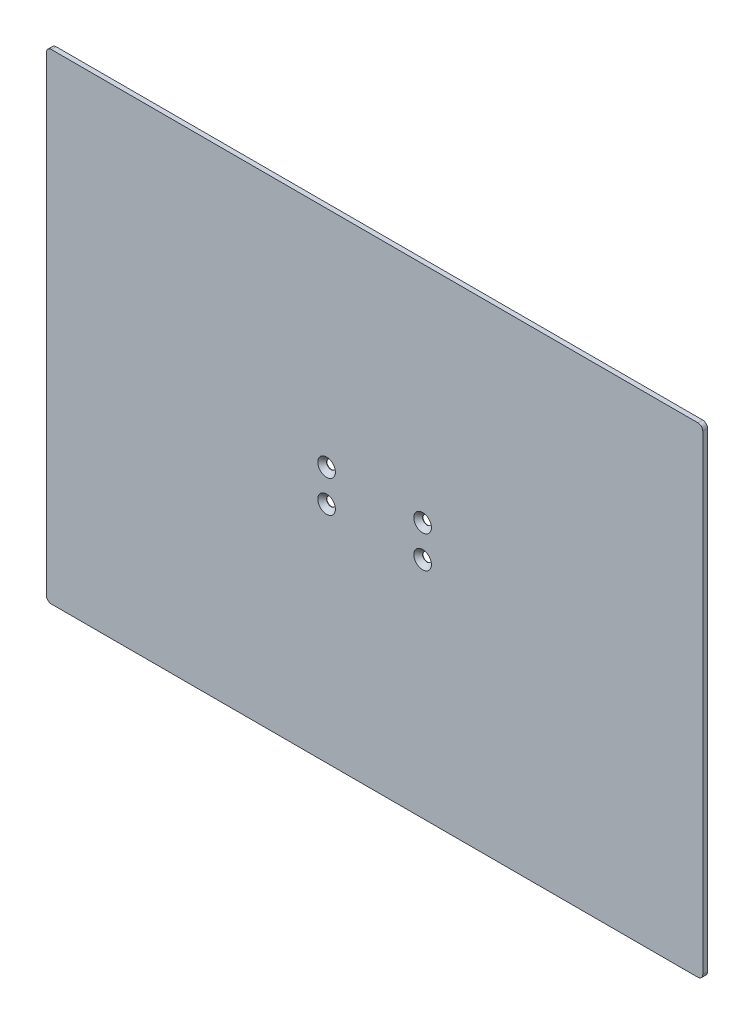
ISO-10303-21;
HEADER;
FILE_DESCRIPTION(('STEP AP214'),'2;1');
FILE_NAME('part.step','',(''),(''),'','','');
FILE_SCHEMA(('AUTOMOTIVE_DESIGN { 1 0 10303 214 1 1 1 1 }'));
ENDSEC;
DATA;
#1=APPLICATION_CONTEXT('core data for automotive mechanical design processes');
#2=APPLICATION_PROTOCOL_DEFINITION('international standard','automotive_design',2000,#1);
#3=PRODUCT_CONTEXT('',#1,'mechanical');
#4=PRODUCT('Part','Part','',(#3));
#5=PRODUCT_RELATED_PRODUCT_CATEGORY('part','',(#4));
#6=PRODUCT_DEFINITION_FORMATION('','',#4);
#7=PRODUCT_DEFINITION_CONTEXT('part definition',#1,'design');
#8=PRODUCT_DEFINITION('design','',#6,#7);
#9=PRODUCT_DEFINITION_SHAPE('','',#8);
#10=(LENGTH_UNIT() NAMED_UNIT(*) SI_UNIT(.MILLI.,.METRE.));
#11=(NAMED_UNIT(*) PLANE_ANGLE_UNIT() SI_UNIT($,.RADIAN.));
#12=(NAMED_UNIT(*) SI_UNIT($,.STERADIAN.) SOLID_ANGLE_UNIT());
#13=UNCERTAINTY_MEASURE_WITH_UNIT(LENGTH_MEASURE(1.E-05),#10,'distance_accuracy_value','');
#14=(GEOMETRIC_REPRESENTATION_CONTEXT(3) GLOBAL_UNCERTAINTY_ASSIGNED_CONTEXT((#13)) GLOBAL_UNIT_ASSIGNED_CONTEXT((#10,
#11,#12)) REPRESENTATION_CONTEXT('',''));
#15=CARTESIAN_POINT('',(0.,0.,0.));
#16=DIRECTION('',(0.,0.,1.));
#17=DIRECTION('',(1.,0.,0.));
#18=AXIS2_PLACEMENT_3D('',#15,#16,#17);
#19=CARTESIAN_POINT('',(0.,0.,1.5));
#20=DIRECTION('',(0.,0.,1.));
#21=DIRECTION('',(1.,0.,0.));
#22=AXIS2_PLACEMENT_3D('',#19,#20,#21);
#23=PLANE('',#22);
#24=CARTESIAN_POINT('',(29.9999999999981,-9.99999999999938,1.5));
#25=DIRECTION('',(0.,0.,-1.));
#26=DIRECTION('',(1.,0.,0.));
#27=AXIS2_PLACEMENT_3D('',#24,#25,#26);
#28=CIRCLE('',#27,5.5);
#29=CARTESIAN_POINT('',(35.4999999999982,-9.99999999999938,1.5));
#30=VERTEX_POINT('',#29);
#31=EDGE_CURVE('E156',#30,#30,#28,.T.);
#32=ORIENTED_EDGE('',*,*,#31,.T.);
#33=EDGE_LOOP('',(#32));
#34=FACE_BOUND('',#33,.T.);
#35=CARTESIAN_POINT('',(-29.999999999999,-9.99999999999934,1.5));
#36=DIRECTION('',(0.,0.,-1.));
#37=DIRECTION('',(1.,0.,0.));
#38=AXIS2_PLACEMENT_3D('',#35,#36,#37);
#39=CIRCLE('',#38,5.5);
#40=CARTESIAN_POINT('',(-24.499999999999,-9.99999999999934,1.5));
#41=VERTEX_POINT('',#40);
#42=EDGE_CURVE('E157',#41,#41,#39,.T.);
#43=ORIENTED_EDGE('',*,*,#42,.T.);
#44=EDGE_LOOP('',(#43));
#45=FACE_BOUND('',#44,.T.);
#46=CARTESIAN_POINT('',(-29.999999999999,9.99999999999977,1.5));
#47=DIRECTION('',(0.,0.,-1.));
#48=DIRECTION('',(1.,0.,0.));
#49=AXIS2_PLACEMENT_3D('',#46,#47,#48);
#50=CIRCLE('',#49,5.5);
#51=CARTESIAN_POINT('',(-24.4999999999989,9.99999999999977,1.5));
#52=VERTEX_POINT('',#51);
#53=EDGE_CURVE('E219',#52,#52,#50,.T.);
#54=ORIENTED_EDGE('',*,*,#53,.T.);
#55=EDGE_LOOP('',(#54));
#56=FACE_BOUND('',#55,.T.);
#57=CARTESIAN_POINT('',(29.9999999999982,9.99999999999973,1.5));
#58=DIRECTION('',(0.,0.,-1.));
#59=DIRECTION('',(1.,0.,0.));
#60=AXIS2_PLACEMENT_3D('',#57,#58,#59);
#61=CIRCLE('',#60,5.5);
#62=CARTESIAN_POINT('',(35.4999999999982,9.99999999999973,1.5));
#63=VERTEX_POINT('',#62);
#64=EDGE_CURVE('E140',#63,#63,#61,.T.);
#65=ORIENTED_EDGE('',*,*,#64,.T.);
#66=EDGE_LOOP('',(#65));
#67=FACE_BOUND('',#66,.T.);
#68=CARTESIAN_POINT('',(-202.,-147.,1.5));
#69=DIRECTION('',(0.,0.,-1.));
#70=DIRECTION('',(-0.707106781186552,-0.707106781186543,0.));
#71=AXIS2_PLACEMENT_3D('',#68,#69,#70);
#72=CIRCLE('',#71,3.);
#73=CARTESIAN_POINT('',(-202.,-150.,1.5));
#74=VERTEX_POINT('',#73);
#75=CARTESIAN_POINT('',(-205.,-147.,1.5));
#76=VERTEX_POINT('',#75);
#77=EDGE_CURVE('E170',#74,#76,#72,.T.);
#78=ORIENTED_EDGE('',*,*,#77,.F.);
#79=DIRECTION('',(1.,0.,0.));
#80=VECTOR('',#79,1.);
#81=CARTESIAN_POINT('',(-205.,-150.,1.5));
#82=LINE('',#81,#80);
#83=CARTESIAN_POINT('',(202.,-150.,1.5));
#84=VERTEX_POINT('',#83);
#85=EDGE_CURVE('E10',#74,#84,#82,.T.);
#86=ORIENTED_EDGE('',*,*,#85,.T.);
#87=CARTESIAN_POINT('',(202.,-147.,1.5));
#88=DIRECTION('',(0.,0.,-1.));
#89=DIRECTION('',(0.707106781186552,-0.707106781186543,0.));
#90=AXIS2_PLACEMENT_3D('',#87,#88,#89);
#91=CIRCLE('',#90,3.);
#92=CARTESIAN_POINT('',(205.,-147.,1.5));
#93=VERTEX_POINT('',#92);
#94=EDGE_CURVE('E148',#93,#84,#91,.T.);
#95=ORIENTED_EDGE('',*,*,#94,.F.);
#96=DIRECTION('',(0.,1.,0.));
#97=VECTOR('',#96,1.);
#98=CARTESIAN_POINT('',(205.,-150.,1.5));
#99=LINE('',#98,#97);
#100=CARTESIAN_POINT('',(205.,147.,1.5));
#101=VERTEX_POINT('',#100);
#102=EDGE_CURVE('E144',#93,#101,#99,.T.);
#103=ORIENTED_EDGE('',*,*,#102,.T.);
#104=CARTESIAN_POINT('',(202.,147.,1.5));
#105=DIRECTION('',(0.,0.,-1.));
#106=DIRECTION('',(0.707106781186543,0.707106781186552,0.));
#107=AXIS2_PLACEMENT_3D('',#104,#105,#106);
#108=CIRCLE('',#107,3.);
#109=CARTESIAN_POINT('',(202.,150.,1.5));
#110=VERTEX_POINT('',#109);
#111=EDGE_CURVE('E136',#110,#101,#108,.T.);
#112=ORIENTED_EDGE('',*,*,#111,.F.);
#113=DIRECTION('',(-1.,0.,0.));
#114=VECTOR('',#113,1.);
#115=CARTESIAN_POINT('',(205.,150.,1.5));
#116=LINE('',#115,#114);
#117=CARTESIAN_POINT('',(-202.,150.,1.5));
#118=VERTEX_POINT('',#117);
#119=EDGE_CURVE('E26',#110,#118,#116,.T.);
#120=ORIENTED_EDGE('',*,*,#119,.T.);
#121=CARTESIAN_POINT('',(-202.,147.,1.5));
#122=DIRECTION('',(0.,0.,-1.));
#123=DIRECTION('',(-0.707106781186543,0.707106781186552,0.));
#124=AXIS2_PLACEMENT_3D('',#121,#122,#123);
#125=CIRCLE('',#124,3.);
#126=CARTESIAN_POINT('',(-205.,147.,1.5));
#127=VERTEX_POINT('',#126);
#128=EDGE_CURVE('E106',#127,#118,#125,.T.);
#129=ORIENTED_EDGE('',*,*,#128,.F.);
#130=DIRECTION('',(0.,-1.,0.));
#131=VECTOR('',#130,1.);
#132=CARTESIAN_POINT('',(-205.,150.,1.5));
#133=LINE('',#132,#131);
#134=EDGE_CURVE('E103',#127,#76,#133,.T.);
#135=ORIENTED_EDGE('',*,*,#134,.T.);
#136=EDGE_LOOP('',(#78,#86,#95,#103,#112,#120,#129,#135));
#137=FACE_BOUND('',#136,.T.);
#138=ADVANCED_FACE('F16',(#34,#45,#56,#67,#137),#23,.T.);
#139=CARTESIAN_POINT('',(-205.,-150.,0.));
#140=DIRECTION('',(0.,-1.,0.));
#141=DIRECTION('',(1.,0.,0.));
#142=AXIS2_PLACEMENT_3D('',#139,#140,#141);
#143=PLANE('',#142);
#144=DIRECTION('',(0.,0.,1.));
#145=VECTOR('',#144,1.);
#146=CARTESIAN_POINT('',(-202.,-150.,0.));
#147=LINE('',#146,#145);
#148=CARTESIAN_POINT('',(-202.,-150.,-1.5));
#149=VERTEX_POINT('',#148);
#150=EDGE_CURVE('E152',#149,#74,#147,.T.);
#151=ORIENTED_EDGE('',*,*,#150,.F.);
#152=DIRECTION('',(-1.,0.,0.));
#153=VECTOR('',#152,1.);
#154=CARTESIAN_POINT('',(-205.,-150.,-1.5));
#155=LINE('',#154,#153);
#156=CARTESIAN_POINT('',(202.,-150.,-1.5));
#157=VERTEX_POINT('',#156);
#158=EDGE_CURVE('E176',#157,#149,#155,.T.);
#159=ORIENTED_EDGE('',*,*,#158,.F.);
#160=DIRECTION('',(0.,0.,-1.));
#161=VECTOR('',#160,1.);
#162=CARTESIAN_POINT('',(202.,-150.,0.));
#163=LINE('',#162,#161);
#164=EDGE_CURVE('E143',#84,#157,#163,.T.);
#165=ORIENTED_EDGE('',*,*,#164,.F.);
#166=ORIENTED_EDGE('',*,*,#85,.F.);
#167=EDGE_LOOP('',(#151,#159,#165,#166));
#168=FACE_BOUND('',#167,.T.);
#169=ADVANCED_FACE('F195',(#168),#143,.T.);
#170=CARTESIAN_POINT('',(205.,150.,0.));
#171=DIRECTION('',(0.,1.,0.));
#172=DIRECTION('',(-1.,0.,0.));
#173=AXIS2_PLACEMENT_3D('',#170,#171,#172);
#174=PLANE('',#173);
#175=DIRECTION('',(0.,0.,-1.));
#176=VECTOR('',#175,1.);
#177=CARTESIAN_POINT('',(-202.,150.,0.));
#178=LINE('',#177,#176);
#179=CARTESIAN_POINT('',(-202.,150.,-1.5));
#180=VERTEX_POINT('',#179);
#181=EDGE_CURVE('E112',#118,#180,#178,.T.);
#182=ORIENTED_EDGE('',*,*,#181,.F.);
#183=ORIENTED_EDGE('',*,*,#119,.F.);
#184=DIRECTION('',(0.,0.,1.));
#185=VECTOR('',#184,1.);
#186=CARTESIAN_POINT('',(202.,150.,0.));
#187=LINE('',#186,#185);
#188=CARTESIAN_POINT('',(202.,150.,-1.5));
#189=VERTEX_POINT('',#188);
#190=EDGE_CURVE('E147',#189,#110,#187,.T.);
#191=ORIENTED_EDGE('',*,*,#190,.F.);
#192=DIRECTION('',(1.,0.,0.));
#193=VECTOR('',#192,1.);
#194=CARTESIAN_POINT('',(205.,150.,-1.5));
#195=LINE('',#194,#193);
#196=EDGE_CURVE('E116',#180,#189,#195,.T.);
#197=ORIENTED_EDGE('',*,*,#196,.F.);
#198=EDGE_LOOP('',(#182,#183,#191,#197));
#199=FACE_BOUND('',#198,.T.);
#200=ADVANCED_FACE('F255',(#199),#174,.T.);
#201=CARTESIAN_POINT('',(29.9999999999981,-9.99999999999938,-506.544289407922));
#202=DIRECTION('',(0.,0.,-1.));
#203=DIRECTION('',(1.,0.,0.));
#204=AXIS2_PLACEMENT_3D('',#201,#202,#203);
#205=CYLINDRICAL_SURFACE('',#204,2.75);
#206=CARTESIAN_POINT('',(29.9999999999981,-9.99999999999938,-1.24999999999999));
#207=DIRECTION('',(0.,0.,1.));
#208=DIRECTION('',(1.,0.,0.));
#209=AXIS2_PLACEMENT_3D('',#206,#207,#208);
#210=CIRCLE('',#209,2.75);
#211=CARTESIAN_POINT('',(32.7499999999981,-9.99999999999938,-1.25));
#212=VERTEX_POINT('',#211);
#213=EDGE_CURVE('E32',#212,#212,#210,.T.);
#214=ORIENTED_EDGE('',*,*,#213,.T.);
#215=EDGE_LOOP('',(#214));
#216=FACE_BOUND('',#215,.T.);
#217=CARTESIAN_POINT('',(29.9999999999981,-9.99999999999938,-1.49999999999999));
#218=DIRECTION('',(0.,0.,1.));
#219=DIRECTION('',(1.,0.,0.));
#220=AXIS2_PLACEMENT_3D('',#217,#218,#219);
#221=CIRCLE('',#220,2.75);
#222=CARTESIAN_POINT('',(27.2499999999981,-9.99999999999938,-1.49999999999999));
#223=VERTEX_POINT('',#222);
#224=EDGE_CURVE('E125',#223,#223,#221,.T.);
#225=ORIENTED_EDGE('',*,*,#224,.F.);
#226=EDGE_LOOP('',(#225));
#227=FACE_BOUND('',#226,.T.);
#228=ADVANCED_FACE('F271',(#216,#227),#205,.F.);
#229=CARTESIAN_POINT('',(29.9999999999981,-9.99999999999938,0.125));
#230=DIRECTION('',(0.,0.,1.));
#231=DIRECTION('',(1.,0.,0.));
#232=AXIS2_PLACEMENT_3D('',#229,#230,#231);
#233=CONICAL_SURFACE('',#232,4.125,0.785398163397448);
#234=ORIENTED_EDGE('',*,*,#213,.F.);
#235=EDGE_LOOP('',(#234));
#236=FACE_BOUND('',#235,.T.);
#237=ORIENTED_EDGE('',*,*,#31,.F.);
#238=EDGE_LOOP('',(#237));
#239=FACE_BOUND('',#238,.T.);
#240=ADVANCED_FACE('F268',(#236,#239),#233,.F.);
#241=CARTESIAN_POINT('',(-29.999999999999,-9.99999999999934,-506.544289407922));
#242=DIRECTION('',(0.,0.,-1.));
#243=DIRECTION('',(1.,0.,0.));
#244=AXIS2_PLACEMENT_3D('',#241,#242,#243);
#245=CYLINDRICAL_SURFACE('',#244,2.75);
#246=CARTESIAN_POINT('',(-29.999999999999,-9.99999999999934,-1.24999999999999));
#247=DIRECTION('',(0.,0.,1.));
#248=DIRECTION('',(1.,0.,0.));
#249=AXIS2_PLACEMENT_3D('',#246,#247,#248);
#250=CIRCLE('',#249,2.75);
#251=CARTESIAN_POINT('',(-27.249999999999,-9.99999999999934,-1.25));
#252=VERTEX_POINT('',#251);
#253=EDGE_CURVE('E153',#252,#252,#250,.T.);
#254=ORIENTED_EDGE('',*,*,#253,.T.);
#255=EDGE_LOOP('',(#254));
#256=FACE_BOUND('',#255,.T.);
#257=CARTESIAN_POINT('',(-29.999999999999,-9.99999999999934,-1.49999999999999));
#258=DIRECTION('',(0.,0.,1.));
#259=DIRECTION('',(1.,0.,0.));
#260=AXIS2_PLACEMENT_3D('',#257,#258,#259);
#261=CIRCLE('',#260,2.75);
#262=CARTESIAN_POINT('',(-32.749999999999,-9.99999999999934,-1.49999999999999));
#263=VERTEX_POINT('',#262);
#264=EDGE_CURVE('E131',#263,#263,#261,.T.);
#265=ORIENTED_EDGE('',*,*,#264,.F.);
#266=EDGE_LOOP('',(#265));
#267=FACE_BOUND('',#266,.T.);
#268=ADVANCED_FACE('F262',(#256,#267),#245,.F.);
#269=CARTESIAN_POINT('',(-29.999999999999,-9.99999999999934,0.125));
#270=DIRECTION('',(0.,0.,1.));
#271=DIRECTION('',(1.,0.,0.));
#272=AXIS2_PLACEMENT_3D('',#269,#270,#271);
#273=CONICAL_SURFACE('',#272,4.125,0.785398163397448);
#274=ORIENTED_EDGE('',*,*,#253,.F.);
#275=EDGE_LOOP('',(#274));
#276=FACE_BOUND('',#275,.T.);
#277=ORIENTED_EDGE('',*,*,#42,.F.);
#278=EDGE_LOOP('',(#277));
#279=FACE_BOUND('',#278,.T.);
#280=ADVANCED_FACE('F243',(#276,#279),#273,.F.);
#281=CARTESIAN_POINT('',(-29.999999999999,9.99999999999977,-506.544289407922));
#282=DIRECTION('',(0.,0.,-1.));
#283=DIRECTION('',(1.,0.,0.));
#284=AXIS2_PLACEMENT_3D('',#281,#282,#283);
#285=CYLINDRICAL_SURFACE('',#284,2.75);
#286=CARTESIAN_POINT('',(-29.999999999999,9.99999999999977,-1.24999999999999));
#287=DIRECTION('',(0.,0.,1.));
#288=DIRECTION('',(1.,0.,0.));
#289=AXIS2_PLACEMENT_3D('',#286,#287,#288);
#290=CIRCLE('',#289,2.75);
#291=CARTESIAN_POINT('',(-27.2499999999989,9.99999999999977,-1.25));
#292=VERTEX_POINT('',#291);
#293=EDGE_CURVE('E180',#292,#292,#290,.T.);
#294=ORIENTED_EDGE('',*,*,#293,.T.);
#295=EDGE_LOOP('',(#294));
#296=FACE_BOUND('',#295,.T.);
#297=CARTESIAN_POINT('',(-29.999999999999,9.99999999999977,-1.49999999999999));
#298=DIRECTION('',(0.,0.,1.));
#299=DIRECTION('',(1.,0.,0.));
#300=AXIS2_PLACEMENT_3D('',#297,#298,#299);
#301=CIRCLE('',#300,2.75);
#302=CARTESIAN_POINT('',(-32.7499999999989,9.99999999999977,-1.49999999999999));
#303=VERTEX_POINT('',#302);
#304=EDGE_CURVE('E134',#303,#303,#301,.T.);
#305=ORIENTED_EDGE('',*,*,#304,.F.);
#306=EDGE_LOOP('',(#305));
#307=FACE_BOUND('',#306,.T.);
#308=ADVANCED_FACE('F232',(#296,#307),#285,.F.);
#309=CARTESIAN_POINT('',(-29.999999999999,9.99999999999977,0.125));
#310=DIRECTION('',(0.,0.,1.));
#311=DIRECTION('',(1.,0.,0.));
#312=AXIS2_PLACEMENT_3D('',#309,#310,#311);
#313=CONICAL_SURFACE('',#312,4.125,0.785398163397448);
#314=ORIENTED_EDGE('',*,*,#293,.F.);
#315=EDGE_LOOP('',(#314));
#316=FACE_BOUND('',#315,.T.);
#317=ORIENTED_EDGE('',*,*,#53,.F.);
#318=EDGE_LOOP('',(#317));
#319=FACE_BOUND('',#318,.T.);
#320=ADVANCED_FACE('F229',(#316,#319),#313,.F.);
#321=CARTESIAN_POINT('',(29.9999999999982,9.99999999999973,-506.544289407922));
#322=DIRECTION('',(0.,0.,-1.));
#323=DIRECTION('',(1.,0.,0.));
#324=AXIS2_PLACEMENT_3D('',#321,#322,#323);
#325=CYLINDRICAL_SURFACE('',#324,2.75);
#326=CARTESIAN_POINT('',(29.9999999999982,9.99999999999973,-1.24999999999999));
#327=DIRECTION('',(0.,0.,1.));
#328=DIRECTION('',(1.,0.,0.));
#329=AXIS2_PLACEMENT_3D('',#326,#327,#328);
#330=CIRCLE('',#329,2.75);
#331=CARTESIAN_POINT('',(32.7499999999982,9.99999999999973,-1.25));
#332=VERTEX_POINT('',#331);
#333=EDGE_CURVE('E142',#332,#332,#330,.T.);
#334=ORIENTED_EDGE('',*,*,#333,.T.);
#335=EDGE_LOOP('',(#334));
#336=FACE_BOUND('',#335,.T.);
#337=CARTESIAN_POINT('',(29.9999999999982,9.99999999999973,-1.49999999999999));
#338=DIRECTION('',(0.,0.,1.));
#339=DIRECTION('',(1.,0.,0.));
#340=AXIS2_PLACEMENT_3D('',#337,#338,#339);
#341=CIRCLE('',#340,2.75);
#342=CARTESIAN_POINT('',(27.2499999999982,9.99999999999973,-1.49999999999999));
#343=VERTEX_POINT('',#342);
#344=EDGE_CURVE('E173',#343,#343,#341,.T.);
#345=ORIENTED_EDGE('',*,*,#344,.F.);
#346=EDGE_LOOP('',(#345));
#347=FACE_BOUND('',#346,.T.);
#348=ADVANCED_FACE('F231',(#336,#347),#325,.F.);
#349=CARTESIAN_POINT('',(29.9999999999982,9.99999999999973,0.125));
#350=DIRECTION('',(0.,0.,1.));
#351=DIRECTION('',(1.,0.,0.));
#352=AXIS2_PLACEMENT_3D('',#349,#350,#351);
#353=CONICAL_SURFACE('',#352,4.125,0.785398163397448);
#354=ORIENTED_EDGE('',*,*,#333,.F.);
#355=EDGE_LOOP('',(#354));
#356=FACE_BOUND('',#355,.T.);
#357=ORIENTED_EDGE('',*,*,#64,.F.);
#358=EDGE_LOOP('',(#357));
#359=FACE_BOUND('',#358,.T.);
#360=ADVANCED_FACE('F240',(#356,#359),#353,.F.);
#361=CARTESIAN_POINT('',(202.,-147.,0.));
#362=DIRECTION('',(0.,0.,-1.));
#363=DIRECTION('',(0.707106781186552,-0.707106781186543,0.));
#364=AXIS2_PLACEMENT_3D('',#361,#362,#363);
#365=CYLINDRICAL_SURFACE('',#364,3.);
#366=ORIENTED_EDGE('',*,*,#94,.T.);
#367=ORIENTED_EDGE('',*,*,#164,.T.);
#368=CARTESIAN_POINT('',(202.,-147.,-1.5));
#369=DIRECTION('',(0.,0.,1.));
#370=DIRECTION('',(0.707106781186552,-0.707106781186543,0.));
#371=AXIS2_PLACEMENT_3D('',#368,#369,#370);
#372=CIRCLE('',#371,3.);
#373=CARTESIAN_POINT('',(205.,-147.,-1.5));
#374=VERTEX_POINT('',#373);
#375=EDGE_CURVE('E162',#157,#374,#372,.T.);
#376=ORIENTED_EDGE('',*,*,#375,.T.);
#377=DIRECTION('',(0.,0.,1.));
#378=VECTOR('',#377,1.);
#379=CARTESIAN_POINT('',(205.,-147.,0.));
#380=LINE('',#379,#378);
#381=EDGE_CURVE('E146',#374,#93,#380,.T.);
#382=ORIENTED_EDGE('',*,*,#381,.T.);
#383=EDGE_LOOP('',(#366,#367,#376,#382));
#384=FACE_BOUND('',#383,.T.);
#385=ADVANCED_FACE('F189',(#384),#365,.T.);
#386=CARTESIAN_POINT('',(205.,-150.,0.));
#387=DIRECTION('',(1.,0.,0.));
#388=DIRECTION('',(0.,1.,0.));
#389=AXIS2_PLACEMENT_3D('',#386,#387,#388);
#390=PLANE('',#389);
#391=DIRECTION('',(0.,0.,-1.));
#392=VECTOR('',#391,1.);
#393=CARTESIAN_POINT('',(205.,147.,0.));
#394=LINE('',#393,#392);
#395=CARTESIAN_POINT('',(205.,147.,-1.5));
#396=VERTEX_POINT('',#395);
#397=EDGE_CURVE('E139',#101,#396,#394,.T.);
#398=ORIENTED_EDGE('',*,*,#397,.F.);
#399=ORIENTED_EDGE('',*,*,#102,.F.);
#400=ORIENTED_EDGE('',*,*,#381,.F.);
#401=DIRECTION('',(0.,-1.,0.));
#402=VECTOR('',#401,1.);
#403=CARTESIAN_POINT('',(205.,-150.,-1.5));
#404=LINE('',#403,#402);
#405=EDGE_CURVE('E158',#396,#374,#404,.T.);
#406=ORIENTED_EDGE('',*,*,#405,.F.);
#407=EDGE_LOOP('',(#398,#399,#400,#406));
#408=FACE_BOUND('',#407,.T.);
#409=ADVANCED_FACE('F275',(#408),#390,.T.);
#410=CARTESIAN_POINT('',(202.,147.,0.));
#411=DIRECTION('',(0.,0.,-1.));
#412=DIRECTION('',(0.707106781186543,0.707106781186552,0.));
#413=AXIS2_PLACEMENT_3D('',#410,#411,#412);
#414=CYLINDRICAL_SURFACE('',#413,3.);
#415=ORIENTED_EDGE('',*,*,#111,.T.);
#416=ORIENTED_EDGE('',*,*,#397,.T.);
#417=CARTESIAN_POINT('',(202.,147.,-1.5));
#418=DIRECTION('',(0.,0.,1.));
#419=DIRECTION('',(0.707106781186543,0.707106781186552,0.));
#420=AXIS2_PLACEMENT_3D('',#417,#418,#419);
#421=CIRCLE('',#420,3.);
#422=EDGE_CURVE('E163',#396,#189,#421,.T.);
#423=ORIENTED_EDGE('',*,*,#422,.T.);
#424=ORIENTED_EDGE('',*,*,#190,.T.);
#425=EDGE_LOOP('',(#415,#416,#423,#424));
#426=FACE_BOUND('',#425,.T.);
#427=ADVANCED_FACE('F18',(#426),#414,.T.);
#428=CARTESIAN_POINT('',(-202.,147.,0.));
#429=DIRECTION('',(0.,0.,-1.));
#430=DIRECTION('',(-0.707106781186543,0.707106781186552,0.));
#431=AXIS2_PLACEMENT_3D('',#428,#429,#430);
#432=CYLINDRICAL_SURFACE('',#431,3.);
#433=ORIENTED_EDGE('',*,*,#128,.T.);
#434=ORIENTED_EDGE('',*,*,#181,.T.);
#435=CARTESIAN_POINT('',(-202.,147.,-1.5));
#436=DIRECTION('',(0.,0.,1.));
#437=DIRECTION('',(-0.707106781186543,0.707106781186552,0.));
#438=AXIS2_PLACEMENT_3D('',#435,#436,#437);
#439=CIRCLE('',#438,3.);
#440=CARTESIAN_POINT('',(-205.,147.,-1.5));
#441=VERTEX_POINT('',#440);
#442=EDGE_CURVE('E109',#180,#441,#439,.T.);
#443=ORIENTED_EDGE('',*,*,#442,.T.);
#444=DIRECTION('',(0.,0.,1.));
#445=VECTOR('',#444,1.);
#446=CARTESIAN_POINT('',(-205.,147.,0.));
#447=LINE('',#446,#445);
#448=EDGE_CURVE('E94',#441,#127,#447,.T.);
#449=ORIENTED_EDGE('',*,*,#448,.T.);
#450=EDGE_LOOP('',(#433,#434,#443,#449));
#451=FACE_BOUND('',#450,.T.);
#452=ADVANCED_FACE('F110',(#451),#432,.T.);
#453=CARTESIAN_POINT('',(-205.,150.,0.));
#454=DIRECTION('',(-1.,0.,0.));
#455=DIRECTION('',(0.,-1.,0.));
#456=AXIS2_PLACEMENT_3D('',#453,#454,#455);
#457=PLANE('',#456);
#458=DIRECTION('',(0.,0.,-1.));
#459=VECTOR('',#458,1.);
#460=CARTESIAN_POINT('',(-205.,-147.,0.));
#461=LINE('',#460,#459);
#462=CARTESIAN_POINT('',(-205.,-147.,-1.5));
#463=VERTEX_POINT('',#462);
#464=EDGE_CURVE('E171',#76,#463,#461,.T.);
#465=ORIENTED_EDGE('',*,*,#464,.F.);
#466=ORIENTED_EDGE('',*,*,#134,.F.);
#467=ORIENTED_EDGE('',*,*,#448,.F.);
#468=DIRECTION('',(0.,1.,0.));
#469=VECTOR('',#468,1.);
#470=CARTESIAN_POINT('',(-205.,150.,-1.5));
#471=LINE('',#470,#469);
#472=EDGE_CURVE('E100',#463,#441,#471,.T.);
#473=ORIENTED_EDGE('',*,*,#472,.F.);
#474=EDGE_LOOP('',(#465,#466,#467,#473));
#475=FACE_BOUND('',#474,.T.);
#476=ADVANCED_FACE('F97',(#475),#457,.T.);
#477=CARTESIAN_POINT('',(0.,0.,-1.5));
#478=DIRECTION('',(0.,0.,-1.));
#479=DIRECTION('',(-1.,0.,0.));
#480=AXIS2_PLACEMENT_3D('',#477,#478,#479);
#481=PLANE('',#480);
#482=CARTESIAN_POINT('',(-202.,-147.,-1.5));
#483=DIRECTION('',(0.,0.,1.));
#484=DIRECTION('',(-0.707106781186552,-0.707106781186543,0.));
#485=AXIS2_PLACEMENT_3D('',#482,#483,#484);
#486=CIRCLE('',#485,3.);
#487=EDGE_CURVE('E123',#463,#149,#486,.T.);
#488=ORIENTED_EDGE('',*,*,#487,.F.);
#489=ORIENTED_EDGE('',*,*,#472,.T.);
#490=ORIENTED_EDGE('',*,*,#442,.F.);
#491=ORIENTED_EDGE('',*,*,#196,.T.);
#492=ORIENTED_EDGE('',*,*,#422,.F.);
#493=ORIENTED_EDGE('',*,*,#405,.T.);
#494=ORIENTED_EDGE('',*,*,#375,.F.);
#495=ORIENTED_EDGE('',*,*,#158,.T.);
#496=EDGE_LOOP('',(#488,#489,#490,#491,#492,#493,#494,#495));
#497=FACE_BOUND('',#496,.T.);
#498=ORIENTED_EDGE('',*,*,#224,.T.);
#499=EDGE_LOOP('',(#498));
#500=FACE_BOUND('',#499,.T.);
#501=ORIENTED_EDGE('',*,*,#264,.T.);
#502=EDGE_LOOP('',(#501));
#503=FACE_BOUND('',#502,.T.);
#504=ORIENTED_EDGE('',*,*,#304,.T.);
#505=EDGE_LOOP('',(#504));
#506=FACE_BOUND('',#505,.T.);
#507=ORIENTED_EDGE('',*,*,#344,.T.);
#508=EDGE_LOOP('',(#507));
#509=FACE_BOUND('',#508,.T.);
#510=ADVANCED_FACE('F119',(#497,#500,#503,#506,#509),#481,.T.);
#511=CARTESIAN_POINT('',(-202.,-147.,0.));
#512=DIRECTION('',(0.,0.,1.));
#513=DIRECTION('',(-0.707106781186552,-0.707106781186543,0.));
#514=AXIS2_PLACEMENT_3D('',#511,#512,#513);
#515=CYLINDRICAL_SURFACE('',#514,3.);
#516=ORIENTED_EDGE('',*,*,#487,.T.);
#517=ORIENTED_EDGE('',*,*,#150,.T.);
#518=ORIENTED_EDGE('',*,*,#77,.T.);
#519=ORIENTED_EDGE('',*,*,#464,.T.);
#520=EDGE_LOOP('',(#516,#517,#518,#519));
#521=FACE_BOUND('',#520,.T.);
#522=ADVANCED_FACE('F207',(#521),#515,.T.);
#523=CLOSED_SHELL('',(#138,#169,#200,#228,#240,#268,#280,#308,#320,#348,#360,#385,#409,#427,
#452,#476,#510,#522));
#524=MANIFOLD_SOLID_BREP('B1',#523);
#525=ADVANCED_BREP_SHAPE_REPRESENTATION('',(#18,#524),#14);
#526=SHAPE_DEFINITION_REPRESENTATION(#9,#525);
ENDSEC;
END-ISO-10303-21;
